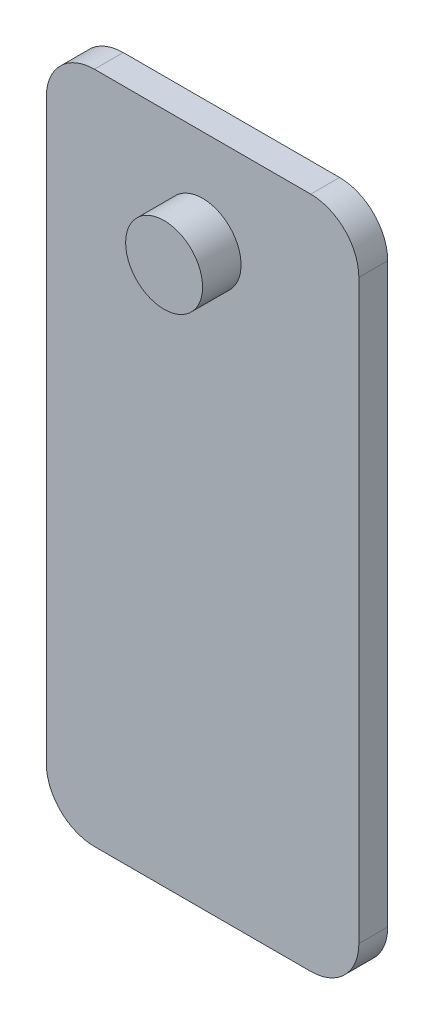
ISO-10303-21;
HEADER;
FILE_DESCRIPTION(('STEP AP214'),'2;1');
FILE_NAME('part.step','',(''),(''),'','','');
FILE_SCHEMA(('AUTOMOTIVE_DESIGN { 1 0 10303 214 1 1 1 1 }'));
ENDSEC;
DATA;
#1=APPLICATION_CONTEXT('core data for automotive mechanical design processes');
#2=APPLICATION_PROTOCOL_DEFINITION('international standard','automotive_design',2000,#1);
#3=PRODUCT_CONTEXT('',#1,'mechanical');
#4=PRODUCT('Part','Part','',(#3));
#5=PRODUCT_RELATED_PRODUCT_CATEGORY('part','',(#4));
#6=PRODUCT_DEFINITION_FORMATION('','',#4);
#7=PRODUCT_DEFINITION_CONTEXT('part definition',#1,'design');
#8=PRODUCT_DEFINITION('design','',#6,#7);
#9=PRODUCT_DEFINITION_SHAPE('','',#8);
#10=(LENGTH_UNIT() NAMED_UNIT(*) SI_UNIT(.MILLI.,.METRE.));
#11=(NAMED_UNIT(*) PLANE_ANGLE_UNIT() SI_UNIT($,.RADIAN.));
#12=(NAMED_UNIT(*) SI_UNIT($,.STERADIAN.) SOLID_ANGLE_UNIT());
#13=UNCERTAINTY_MEASURE_WITH_UNIT(LENGTH_MEASURE(1.E-05),#10,'distance_accuracy_value','');
#14=(GEOMETRIC_REPRESENTATION_CONTEXT(3) GLOBAL_UNCERTAINTY_ASSIGNED_CONTEXT((#13)) GLOBAL_UNIT_ASSIGNED_CONTEXT((#10,
#11,#12)) REPRESENTATION_CONTEXT('',''));
#15=CARTESIAN_POINT('',(0.,0.,0.));
#16=DIRECTION('',(0.,0.,1.));
#17=DIRECTION('',(1.,0.,0.));
#18=AXIS2_PLACEMENT_3D('',#15,#16,#17);
#19=CARTESIAN_POINT('',(-24.375,52.1389846093061,3.69945784530285));
#20=DIRECTION('',(1.,0.,0.));
#21=DIRECTION('',(0.,1.,0.));
#22=AXIS2_PLACEMENT_3D('',#19,#20,#21);
#23=PLANE('',#22);
#24=DIRECTION('',(0.,-1.,0.));
#25=VECTOR('',#24,1.);
#26=CARTESIAN_POINT('',(-24.375,52.1389846093061,-0.80054215469715));
#27=LINE('',#26,#25);
#28=CARTESIAN_POINT('',(-24.375,44.6389846093061,-0.80054215469715));
#29=VERTEX_POINT('',#28);
#30=CARTESIAN_POINT('',(-24.375,-45.361015390694,-0.80054215469715));
#31=VERTEX_POINT('',#30);
#32=EDGE_CURVE('E130',#29,#31,#27,.T.);
#33=ORIENTED_EDGE('',*,*,#32,.T.);
#34=DIRECTION('',(0.,0.,-1.));
#35=VECTOR('',#34,1.);
#36=CARTESIAN_POINT('',(-24.375,-45.361015390694,3.69945784530285));
#37=LINE('',#36,#35);
#38=CARTESIAN_POINT('',(-24.375,-45.361015390694,3.69945784530285));
#39=VERTEX_POINT('',#38);
#40=EDGE_CURVE('E108',#31,#39,#37,.F.);
#41=ORIENTED_EDGE('',*,*,#40,.T.);
#42=DIRECTION('',(0.,-1.,0.));
#43=VECTOR('',#42,1.);
#44=CARTESIAN_POINT('',(-24.375,52.1389846093061,3.69945784530285));
#45=LINE('',#44,#43);
#46=CARTESIAN_POINT('',(-24.375,44.6389846093061,3.69945784530285));
#47=VERTEX_POINT('',#46);
#48=EDGE_CURVE('E140',#47,#39,#45,.T.);
#49=ORIENTED_EDGE('',*,*,#48,.F.);
#50=DIRECTION('',(0.,0.,-1.));
#51=VECTOR('',#50,1.);
#52=CARTESIAN_POINT('',(-24.375,44.6389846093061,3.69945784530285));
#53=LINE('',#52,#51);
#54=EDGE_CURVE('E113',#47,#29,#53,.T.);
#55=ORIENTED_EDGE('',*,*,#54,.T.);
#56=EDGE_LOOP('',(#33,#41,#49,#55));
#57=FACE_BOUND('',#56,.T.);
#58=ADVANCED_FACE('F36',(#57),#23,.F.);
#59=CARTESIAN_POINT('',(24.375,-52.861015390694,3.69945784530285));
#60=DIRECTION('',(0.,1.,0.));
#61=DIRECTION('',(-1.,0.,0.));
#62=AXIS2_PLACEMENT_3D('',#59,#60,#61);
#63=PLANE('',#62);
#64=DIRECTION('',(1.,0.,0.));
#65=VECTOR('',#64,1.);
#66=CARTESIAN_POINT('',(24.375,-52.861015390694,3.69945784530285));
#67=LINE('',#66,#65);
#68=CARTESIAN_POINT('',(-16.875,-52.861015390694,3.69945784530285));
#69=VERTEX_POINT('',#68);
#70=CARTESIAN_POINT('',(16.875,-52.861015390694,3.69945784530285));
#71=VERTEX_POINT('',#70);
#72=EDGE_CURVE('E123',#69,#71,#67,.T.);
#73=ORIENTED_EDGE('',*,*,#72,.F.);
#74=DIRECTION('',(0.,0.,-1.));
#75=VECTOR('',#74,1.);
#76=CARTESIAN_POINT('',(-16.875,-52.861015390694,3.69945784530285));
#77=LINE('',#76,#75);
#78=CARTESIAN_POINT('',(-16.875,-52.861015390694,-0.80054215469715));
#79=VERTEX_POINT('',#78);
#80=EDGE_CURVE('E107',#69,#79,#77,.T.);
#81=ORIENTED_EDGE('',*,*,#80,.T.);
#82=DIRECTION('',(1.,0.,0.));
#83=VECTOR('',#82,1.);
#84=CARTESIAN_POINT('',(24.375,-52.861015390694,-0.80054215469715));
#85=LINE('',#84,#83);
#86=CARTESIAN_POINT('',(16.875,-52.861015390694,-0.80054215469715));
#87=VERTEX_POINT('',#86);
#88=EDGE_CURVE('E120',#79,#87,#85,.T.);
#89=ORIENTED_EDGE('',*,*,#88,.T.);
#90=DIRECTION('',(0.,0.,-1.));
#91=VECTOR('',#90,1.);
#92=CARTESIAN_POINT('',(16.875,-52.861015390694,3.69945784530285));
#93=LINE('',#92,#91);
#94=EDGE_CURVE('E125',#87,#71,#93,.F.);
#95=ORIENTED_EDGE('',*,*,#94,.T.);
#96=EDGE_LOOP('',(#73,#81,#89,#95));
#97=FACE_BOUND('',#96,.T.);
#98=ADVANCED_FACE('F119',(#97),#63,.F.);
#99=CARTESIAN_POINT('',(24.375,52.1389846093061,3.69945784530285));
#100=DIRECTION('',(-1.,0.,0.));
#101=DIRECTION('',(0.,-1.,0.));
#102=AXIS2_PLACEMENT_3D('',#99,#100,#101);
#103=PLANE('',#102);
#104=DIRECTION('',(0.,1.,0.));
#105=VECTOR('',#104,1.);
#106=CARTESIAN_POINT('',(24.375,52.1389846093061,3.69945784530285));
#107=LINE('',#106,#105);
#108=CARTESIAN_POINT('',(24.375,-45.3610153906939,3.69945784530285));
#109=VERTEX_POINT('',#108);
#110=CARTESIAN_POINT('',(24.375,44.6389846093061,3.69945784530285));
#111=VERTEX_POINT('',#110);
#112=EDGE_CURVE('E174',#109,#111,#107,.T.);
#113=ORIENTED_EDGE('',*,*,#112,.F.);
#114=DIRECTION('',(0.,0.,-1.));
#115=VECTOR('',#114,1.);
#116=CARTESIAN_POINT('',(24.375,-45.3610153906939,3.69945784530285));
#117=LINE('',#116,#115);
#118=CARTESIAN_POINT('',(24.375,-45.3610153906939,-0.80054215469715));
#119=VERTEX_POINT('',#118);
#120=EDGE_CURVE('E159',#109,#119,#117,.T.);
#121=ORIENTED_EDGE('',*,*,#120,.T.);
#122=DIRECTION('',(0.,1.,0.));
#123=VECTOR('',#122,1.);
#124=CARTESIAN_POINT('',(24.375,52.1389846093061,-0.80054215469715));
#125=LINE('',#124,#123);
#126=CARTESIAN_POINT('',(24.375,44.6389846093061,-0.80054215469715));
#127=VERTEX_POINT('',#126);
#128=EDGE_CURVE('E129',#119,#127,#125,.T.);
#129=ORIENTED_EDGE('',*,*,#128,.T.);
#130=DIRECTION('',(0.,0.,-1.));
#131=VECTOR('',#130,1.);
#132=CARTESIAN_POINT('',(24.375,44.6389846093061,3.69945784530285));
#133=LINE('',#132,#131);
#134=EDGE_CURVE('E157',#127,#111,#133,.F.);
#135=ORIENTED_EDGE('',*,*,#134,.T.);
#136=EDGE_LOOP('',(#113,#121,#129,#135));
#137=FACE_BOUND('',#136,.T.);
#138=ADVANCED_FACE('F187',(#137),#103,.F.);
#139=CARTESIAN_POINT('',(24.375,52.1389846093061,3.69945784530285));
#140=DIRECTION('',(0.,-1.,0.));
#141=DIRECTION('',(1.,0.,0.));
#142=AXIS2_PLACEMENT_3D('',#139,#140,#141);
#143=PLANE('',#142);
#144=DIRECTION('',(-1.,0.,0.));
#145=VECTOR('',#144,1.);
#146=CARTESIAN_POINT('',(24.375,52.1389846093061,3.69945784530285));
#147=LINE('',#146,#145);
#148=CARTESIAN_POINT('',(16.875,52.1389846093061,3.69945784530285));
#149=VERTEX_POINT('',#148);
#150=CARTESIAN_POINT('',(-16.875,52.1389846093061,3.69945784530285));
#151=VERTEX_POINT('',#150);
#152=EDGE_CURVE('E141',#149,#151,#147,.T.);
#153=ORIENTED_EDGE('',*,*,#152,.F.);
#154=DIRECTION('',(0.,0.,-1.));
#155=VECTOR('',#154,1.);
#156=CARTESIAN_POINT('',(16.875,52.1389846093061,3.69945784530285));
#157=LINE('',#156,#155);
#158=CARTESIAN_POINT('',(16.875,52.1389846093061,-0.80054215469715));
#159=VERTEX_POINT('',#158);
#160=EDGE_CURVE('E44',#149,#159,#157,.T.);
#161=ORIENTED_EDGE('',*,*,#160,.T.);
#162=DIRECTION('',(-1.,0.,0.));
#163=VECTOR('',#162,1.);
#164=CARTESIAN_POINT('',(24.375,52.1389846093061,-0.80054215469715));
#165=LINE('',#164,#163);
#166=CARTESIAN_POINT('',(-16.875,52.1389846093061,-0.80054215469715));
#167=VERTEX_POINT('',#166);
#168=EDGE_CURVE('E133',#159,#167,#165,.T.);
#169=ORIENTED_EDGE('',*,*,#168,.T.);
#170=DIRECTION('',(0.,0.,-1.));
#171=VECTOR('',#170,1.);
#172=CARTESIAN_POINT('',(-16.875,52.1389846093061,3.69945784530285));
#173=LINE('',#172,#171);
#174=EDGE_CURVE('E51',#167,#151,#173,.F.);
#175=ORIENTED_EDGE('',*,*,#174,.T.);
#176=EDGE_LOOP('',(#153,#161,#169,#175));
#177=FACE_BOUND('',#176,.T.);
#178=ADVANCED_FACE('F165',(#177),#143,.F.);
#179=CARTESIAN_POINT('',(0.,-0.361015390693925,3.69945784530285));
#180=DIRECTION('',(0.,0.,-1.));
#181=DIRECTION('',(-1.,0.,0.));
#182=AXIS2_PLACEMENT_3D('',#179,#180,#181);
#183=PLANE('',#182);
#184=CARTESIAN_POINT('',(0.,37.1389846093061,3.69945784530285));
#185=DIRECTION('',(0.,0.,-1.));
#186=DIRECTION('',(-1.,0.,0.));
#187=AXIS2_PLACEMENT_3D('',#184,#185,#186);
#188=CIRCLE('',#187,6.);
#189=CARTESIAN_POINT('',(-6.,37.1389846093061,3.69945784530285));
#190=VERTEX_POINT('',#189);
#191=EDGE_CURVE('E11',#190,#190,#188,.F.);
#192=ORIENTED_EDGE('',*,*,#191,.F.);
#193=EDGE_LOOP('',(#192));
#194=FACE_BOUND('',#193,.T.);
#195=ORIENTED_EDGE('',*,*,#48,.T.);
#196=CARTESIAN_POINT('',(-16.875,-45.361015390694,3.69945784530285));
#197=DIRECTION('',(0.,0.,-1.));
#198=DIRECTION('',(-1.,0.,0.));
#199=AXIS2_PLACEMENT_3D('',#196,#197,#198);
#200=CIRCLE('',#199,7.5);
#201=EDGE_CURVE('E155',#39,#69,#200,.F.);
#202=ORIENTED_EDGE('',*,*,#201,.T.);
#203=ORIENTED_EDGE('',*,*,#72,.T.);
#204=CARTESIAN_POINT('',(16.875,-45.3610153906939,3.69945784530285));
#205=DIRECTION('',(0.,0.,-1.));
#206=DIRECTION('',(-1.,0.,0.));
#207=AXIS2_PLACEMENT_3D('',#204,#205,#206);
#208=CIRCLE('',#207,7.5);
#209=EDGE_CURVE('E153',#71,#109,#208,.F.);
#210=ORIENTED_EDGE('',*,*,#209,.T.);
#211=ORIENTED_EDGE('',*,*,#112,.T.);
#212=CARTESIAN_POINT('',(16.875,44.6389846093061,3.69945784530285));
#213=DIRECTION('',(0.,0.,-1.));
#214=DIRECTION('',(-1.,0.,0.));
#215=AXIS2_PLACEMENT_3D('',#212,#213,#214);
#216=CIRCLE('',#215,7.5);
#217=EDGE_CURVE('E58',#111,#149,#216,.F.);
#218=ORIENTED_EDGE('',*,*,#217,.T.);
#219=ORIENTED_EDGE('',*,*,#152,.T.);
#220=CARTESIAN_POINT('',(-16.875,44.6389846093061,3.69945784530285));
#221=DIRECTION('',(0.,0.,-1.));
#222=DIRECTION('',(-1.,0.,0.));
#223=AXIS2_PLACEMENT_3D('',#220,#221,#222);
#224=CIRCLE('',#223,7.5);
#225=EDGE_CURVE('E150',#151,#47,#224,.F.);
#226=ORIENTED_EDGE('',*,*,#225,.T.);
#227=EDGE_LOOP('',(#195,#202,#203,#210,#211,#218,#219,#226));
#228=FACE_BOUND('',#227,.T.);
#229=ADVANCED_FACE('F178',(#194,#228),#183,.F.);
#230=CARTESIAN_POINT('',(0.,-0.361015390693925,-0.80054215469715));
#231=DIRECTION('',(0.,0.,-1.));
#232=DIRECTION('',(-1.,0.,0.));
#233=AXIS2_PLACEMENT_3D('',#230,#231,#232);
#234=PLANE('',#233);
#235=ORIENTED_EDGE('',*,*,#88,.F.);
#236=CARTESIAN_POINT('',(-16.875,-45.361015390694,-0.80054215469715));
#237=DIRECTION('',(0.,0.,-1.));
#238=DIRECTION('',(-1.,0.,0.));
#239=AXIS2_PLACEMENT_3D('',#236,#237,#238);
#240=CIRCLE('',#239,7.5);
#241=EDGE_CURVE('E103',#79,#31,#240,.T.);
#242=ORIENTED_EDGE('',*,*,#241,.T.);
#243=ORIENTED_EDGE('',*,*,#32,.F.);
#244=CARTESIAN_POINT('',(-16.875,44.6389846093061,-0.80054215469715));
#245=DIRECTION('',(0.,0.,-1.));
#246=DIRECTION('',(-1.,0.,0.));
#247=AXIS2_PLACEMENT_3D('',#244,#245,#246);
#248=CIRCLE('',#247,7.5);
#249=EDGE_CURVE('E124',#29,#167,#248,.T.);
#250=ORIENTED_EDGE('',*,*,#249,.T.);
#251=ORIENTED_EDGE('',*,*,#168,.F.);
#252=CARTESIAN_POINT('',(16.875,44.6389846093061,-0.80054215469715));
#253=DIRECTION('',(0.,0.,-1.));
#254=DIRECTION('',(-1.,0.,0.));
#255=AXIS2_PLACEMENT_3D('',#252,#253,#254);
#256=CIRCLE('',#255,7.5);
#257=EDGE_CURVE('E144',#159,#127,#256,.T.);
#258=ORIENTED_EDGE('',*,*,#257,.T.);
#259=ORIENTED_EDGE('',*,*,#128,.F.);
#260=CARTESIAN_POINT('',(16.875,-45.3610153906939,-0.80054215469715));
#261=DIRECTION('',(0.,0.,-1.));
#262=DIRECTION('',(-1.,0.,0.));
#263=AXIS2_PLACEMENT_3D('',#260,#261,#262);
#264=CIRCLE('',#263,7.5);
#265=EDGE_CURVE('E114',#119,#87,#264,.T.);
#266=ORIENTED_EDGE('',*,*,#265,.T.);
#267=EDGE_LOOP('',(#235,#242,#243,#250,#251,#258,#259,#266));
#268=FACE_BOUND('',#267,.T.);
#269=ADVANCED_FACE('F127',(#268),#234,.T.);
#270=CARTESIAN_POINT('',(-16.875,-45.361015390694,3.69945784530285));
#271=DIRECTION('',(0.,0.,-1.));
#272=DIRECTION('',(-1.,0.,0.));
#273=AXIS2_PLACEMENT_3D('',#270,#271,#272);
#274=CYLINDRICAL_SURFACE('',#273,7.5);
#275=ORIENTED_EDGE('',*,*,#201,.F.);
#276=ORIENTED_EDGE('',*,*,#40,.F.);
#277=ORIENTED_EDGE('',*,*,#241,.F.);
#278=ORIENTED_EDGE('',*,*,#80,.F.);
#279=EDGE_LOOP('',(#275,#276,#277,#278));
#280=FACE_BOUND('',#279,.T.);
#281=ADVANCED_FACE('F106',(#280),#274,.T.);
#282=CARTESIAN_POINT('',(16.875,-45.3610153906939,3.69945784530285));
#283=DIRECTION('',(0.,0.,-1.));
#284=DIRECTION('',(-1.,0.,0.));
#285=AXIS2_PLACEMENT_3D('',#282,#283,#284);
#286=CYLINDRICAL_SURFACE('',#285,7.5);
#287=ORIENTED_EDGE('',*,*,#209,.F.);
#288=ORIENTED_EDGE('',*,*,#94,.F.);
#289=ORIENTED_EDGE('',*,*,#265,.F.);
#290=ORIENTED_EDGE('',*,*,#120,.F.);
#291=EDGE_LOOP('',(#287,#288,#289,#290));
#292=FACE_BOUND('',#291,.T.);
#293=ADVANCED_FACE('F201',(#292),#286,.T.);
#294=CARTESIAN_POINT('',(16.875,44.6389846093061,3.69945784530285));
#295=DIRECTION('',(0.,0.,-1.));
#296=DIRECTION('',(-1.,0.,0.));
#297=AXIS2_PLACEMENT_3D('',#294,#295,#296);
#298=CYLINDRICAL_SURFACE('',#297,7.5);
#299=ORIENTED_EDGE('',*,*,#217,.F.);
#300=ORIENTED_EDGE('',*,*,#134,.F.);
#301=ORIENTED_EDGE('',*,*,#257,.F.);
#302=ORIENTED_EDGE('',*,*,#160,.F.);
#303=EDGE_LOOP('',(#299,#300,#301,#302));
#304=FACE_BOUND('',#303,.T.);
#305=ADVANCED_FACE('F203',(#304),#298,.T.);
#306=CARTESIAN_POINT('',(-16.875,44.6389846093061,3.69945784530285));
#307=DIRECTION('',(0.,0.,-1.));
#308=DIRECTION('',(-1.,0.,0.));
#309=AXIS2_PLACEMENT_3D('',#306,#307,#308);
#310=CYLINDRICAL_SURFACE('',#309,7.5);
#311=ORIENTED_EDGE('',*,*,#225,.F.);
#312=ORIENTED_EDGE('',*,*,#174,.F.);
#313=ORIENTED_EDGE('',*,*,#249,.F.);
#314=ORIENTED_EDGE('',*,*,#54,.F.);
#315=EDGE_LOOP('',(#311,#312,#313,#314));
#316=FACE_BOUND('',#315,.T.);
#317=ADVANCED_FACE('F38',(#316),#310,.T.);
#318=CARTESIAN_POINT('',(0.,37.1389846093061,9.69945784530285));
#319=DIRECTION('',(0.,0.,-1.));
#320=DIRECTION('',(-1.,0.,0.));
#321=AXIS2_PLACEMENT_3D('',#318,#319,#320);
#322=CYLINDRICAL_SURFACE('',#321,6.);
#323=CARTESIAN_POINT('',(0.,37.1389846093061,9.69945784530285));
#324=DIRECTION('',(0.,0.,1.));
#325=DIRECTION('',(1.,0.,0.));
#326=AXIS2_PLACEMENT_3D('',#323,#324,#325);
#327=CIRCLE('',#326,6.);
#328=CARTESIAN_POINT('',(6.,37.1389846093061,9.69945784530285));
#329=VERTEX_POINT('',#328);
#330=EDGE_CURVE('E135',#329,#329,#327,.T.);
#331=ORIENTED_EDGE('',*,*,#330,.F.);
#332=EDGE_LOOP('',(#331));
#333=FACE_BOUND('',#332,.T.);
#334=ORIENTED_EDGE('',*,*,#191,.T.);
#335=EDGE_LOOP('',(#334));
#336=FACE_BOUND('',#335,.T.);
#337=ADVANCED_FACE('F209',(#333,#336),#322,.T.);
#338=CARTESIAN_POINT('',(0.,37.1389846093061,9.69945784530285));
#339=DIRECTION('',(0.,0.,1.));
#340=DIRECTION('',(1.,0.,0.));
#341=AXIS2_PLACEMENT_3D('',#338,#339,#340);
#342=PLANE('',#341);
#343=ORIENTED_EDGE('',*,*,#330,.T.);
#344=EDGE_LOOP('',(#343));
#345=FACE_BOUND('',#344,.T.);
#346=ADVANCED_FACE('F265',(#345),#342,.T.);
#347=CLOSED_SHELL('',(#58,#98,#138,#178,#229,#269,#281,#293,#305,#317,#337,#346));
#348=MANIFOLD_SOLID_BREP('B2',#347);
#349=ADVANCED_BREP_SHAPE_REPRESENTATION('',(#18,#348),#14);
#350=SHAPE_DEFINITION_REPRESENTATION(#9,#349);
ENDSEC;
END-ISO-10303-21;
